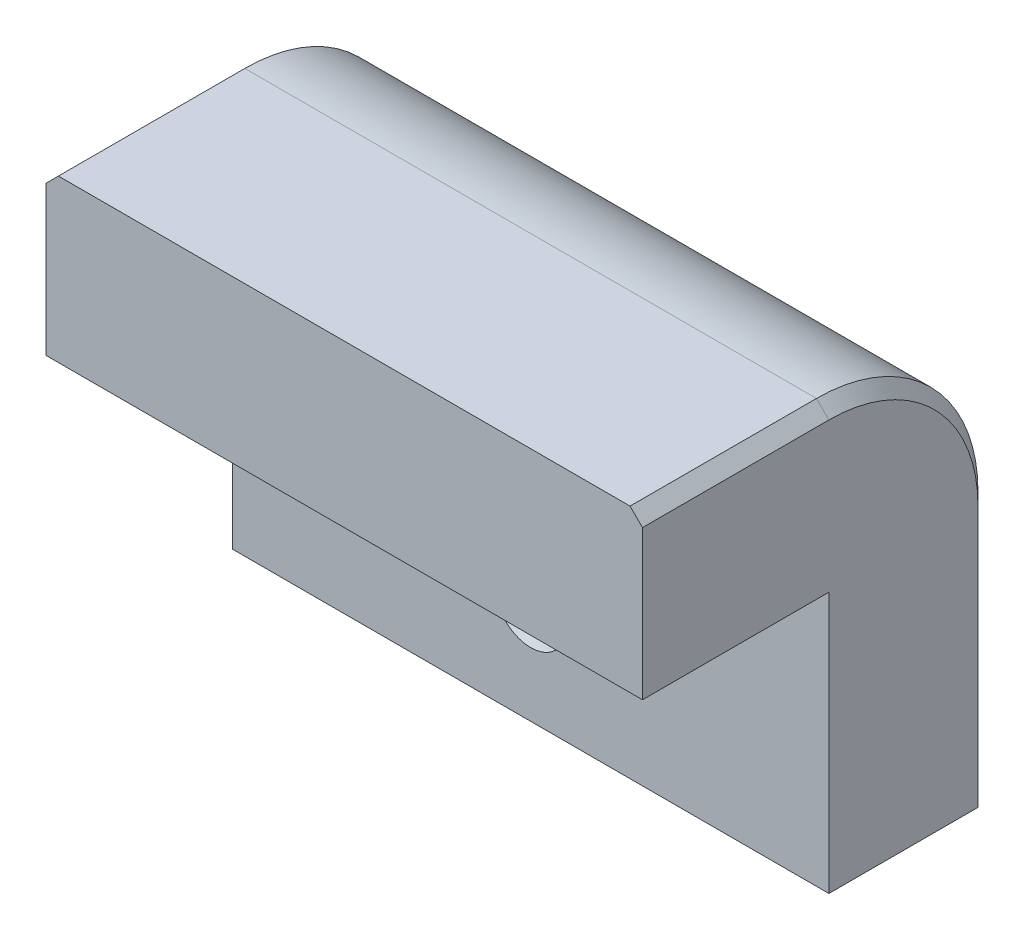
ISO-10303-21;
HEADER;
FILE_DESCRIPTION(('STEP AP214'),'2;1');
FILE_NAME('part.step','',(''),(''),'','','');
FILE_SCHEMA(('AUTOMOTIVE_DESIGN { 1 0 10303 214 1 1 1 1 }'));
ENDSEC;
DATA;
#1=APPLICATION_CONTEXT('core data for automotive mechanical design processes');
#2=APPLICATION_PROTOCOL_DEFINITION('international standard','automotive_design',2000,#1);
#3=PRODUCT_CONTEXT('',#1,'mechanical');
#4=PRODUCT('Part','Part','',(#3));
#5=PRODUCT_RELATED_PRODUCT_CATEGORY('part','',(#4));
#6=PRODUCT_DEFINITION_FORMATION('','',#4);
#7=PRODUCT_DEFINITION_CONTEXT('part definition',#1,'design');
#8=PRODUCT_DEFINITION('design','',#6,#7);
#9=PRODUCT_DEFINITION_SHAPE('','',#8);
#10=(LENGTH_UNIT() NAMED_UNIT(*) SI_UNIT(.MILLI.,.METRE.));
#11=(NAMED_UNIT(*) PLANE_ANGLE_UNIT() SI_UNIT($,.RADIAN.));
#12=(NAMED_UNIT(*) SI_UNIT($,.STERADIAN.) SOLID_ANGLE_UNIT());
#13=UNCERTAINTY_MEASURE_WITH_UNIT(LENGTH_MEASURE(1.E-05),#10,'distance_accuracy_value','');
#14=(GEOMETRIC_REPRESENTATION_CONTEXT(3) GLOBAL_UNCERTAINTY_ASSIGNED_CONTEXT((#13)) GLOBAL_UNIT_ASSIGNED_CONTEXT((#10,
#11,#12)) REPRESENTATION_CONTEXT('',''));
#15=CARTESIAN_POINT('',(0.,0.,0.));
#16=DIRECTION('',(0.,0.,1.));
#17=DIRECTION('',(1.,0.,0.));
#18=AXIS2_PLACEMENT_3D('',#15,#16,#17);
#19=CARTESIAN_POINT('',(-30.48,19.05,-8.255));
#20=DIRECTION('',(1.,0.,0.));
#21=DIRECTION('',(0.,0.,-1.));
#22=AXIS2_PLACEMENT_3D('',#19,#20,#21);
#23=PLANE('',#22);
#24=CARTESIAN_POINT('',(-30.48,19.05,8.255));
#25=DIRECTION('',(1.,0.,0.));
#26=DIRECTION('',(0.,0.,-1.));
#27=AXIS2_PLACEMENT_3D('',#24,#25,#26);
#28=CIRCLE('',#27,15.24);
#29=CARTESIAN_POINT('',(-30.48,34.29,8.25499999999995));
#30=VERTEX_POINT('',#29);
#31=CARTESIAN_POINT('',(-30.48,19.05,-6.985));
#32=VERTEX_POINT('',#31);
#33=EDGE_CURVE('E42',#30,#32,#28,.F.);
#34=ORIENTED_EDGE('',*,*,#33,.T.);
#35=DIRECTION('',(0.,-1.,0.));
#36=VECTOR('',#35,1.);
#37=CARTESIAN_POINT('',(-30.48,19.05,-6.985));
#38=LINE('',#37,#36);
#39=CARTESIAN_POINT('',(-30.48,-7.62,-6.98499999999999));
#40=VERTEX_POINT('',#39);
#41=EDGE_CURVE('E11',#32,#40,#38,.T.);
#42=ORIENTED_EDGE('',*,*,#41,.T.);
#43=DIRECTION('',(0.,0.,-1.));
#44=VECTOR('',#43,1.);
#45=CARTESIAN_POINT('',(-30.48,-7.62,8.255));
#46=LINE('',#45,#44);
#47=CARTESIAN_POINT('',(-30.48,-7.62,8.255));
#48=VERTEX_POINT('',#47);
#49=EDGE_CURVE('E189',#48,#40,#46,.T.);
#50=ORIENTED_EDGE('',*,*,#49,.F.);
#51=DIRECTION('',(0.,-1.,0.));
#52=VECTOR('',#51,1.);
#53=CARTESIAN_POINT('',(-30.48,19.05,8.255));
#54=LINE('',#53,#52);
#55=CARTESIAN_POINT('',(-30.48,19.05,8.255));
#56=VERTEX_POINT('',#55);
#57=EDGE_CURVE('E302',#56,#48,#54,.T.);
#58=ORIENTED_EDGE('',*,*,#57,.F.);
#59=DIRECTION('',(0.,0.,1.));
#60=VECTOR('',#59,1.);
#61=CARTESIAN_POINT('',(-30.48,19.05,-8.25500000000001));
#62=LINE('',#61,#60);
#63=CARTESIAN_POINT('',(-30.48,19.0500000000001,27.305));
#64=VERTEX_POINT('',#63);
#65=EDGE_CURVE('E204',#56,#64,#62,.T.);
#66=ORIENTED_EDGE('',*,*,#65,.T.);
#67=DIRECTION('',(0.,1.,0.));
#68=VECTOR('',#67,1.);
#69=CARTESIAN_POINT('',(-30.48,35.5600000000001,27.3049999999999));
#70=LINE('',#69,#68);
#71=CARTESIAN_POINT('',(-30.48,34.2900000000001,27.305));
#72=VERTEX_POINT('',#71);
#73=EDGE_CURVE('E202',#64,#72,#70,.T.);
#74=ORIENTED_EDGE('',*,*,#73,.T.);
#75=DIRECTION('',(0.,0.,-1.));
#76=VECTOR('',#75,1.);
#77=CARTESIAN_POINT('',(-30.48,34.29,8.25499999999995));
#78=LINE('',#77,#76);
#79=EDGE_CURVE('E53',#72,#30,#78,.T.);
#80=ORIENTED_EDGE('',*,*,#79,.T.);
#81=EDGE_LOOP('',(#34,#42,#50,#58,#66,#74,#80));
#82=FACE_BOUND('',#81,.T.);
#83=ADVANCED_FACE('F33',(#82),#23,.F.);
#84=CARTESIAN_POINT('',(-30.48,19.05,8.255));
#85=DIRECTION('',(0.,0.,-1.));
#86=DIRECTION('',(-1.,0.,0.));
#87=AXIS2_PLACEMENT_3D('',#84,#85,#86);
#88=PLANE('',#87);
#89=CARTESIAN_POINT('',(0.,2.5399999999999,8.255));
#90=DIRECTION('',(0.,0.,-1.));
#91=DIRECTION('',(-1.,0.,0.));
#92=AXIS2_PLACEMENT_3D('',#89,#90,#91);
#93=CIRCLE('',#92,3.63220000000002);
#94=CARTESIAN_POINT('',(-3.63220000000004,2.5399999999999,8.255));
#95=VERTEX_POINT('',#94);
#96=EDGE_CURVE('E292',#95,#95,#93,.T.);
#97=ORIENTED_EDGE('',*,*,#96,.T.);
#98=EDGE_LOOP('',(#97));
#99=FACE_BOUND('',#98,.T.);
#100=ORIENTED_EDGE('',*,*,#57,.T.);
#101=DIRECTION('',(-1.,0.,0.));
#102=VECTOR('',#101,1.);
#103=CARTESIAN_POINT('',(-30.48,-7.62,8.255));
#104=LINE('',#103,#102);
#105=CARTESIAN_POINT('',(30.48,-7.62,8.255));
#106=VERTEX_POINT('',#105);
#107=EDGE_CURVE('E198',#106,#48,#104,.T.);
#108=ORIENTED_EDGE('',*,*,#107,.F.);
#109=DIRECTION('',(0.,-1.,0.));
#110=VECTOR('',#109,1.);
#111=CARTESIAN_POINT('',(30.48,19.05,8.255));
#112=LINE('',#111,#110);
#113=CARTESIAN_POINT('',(30.48,19.05,8.255));
#114=VERTEX_POINT('',#113);
#115=EDGE_CURVE('E306',#114,#106,#112,.T.);
#116=ORIENTED_EDGE('',*,*,#115,.F.);
#117=DIRECTION('',(1.,0.,0.));
#118=VECTOR('',#117,1.);
#119=CARTESIAN_POINT('',(-30.48,19.05,8.255));
#120=LINE('',#119,#118);
#121=EDGE_CURVE('E212',#56,#114,#120,.T.);
#122=ORIENTED_EDGE('',*,*,#121,.F.);
#123=EDGE_LOOP('',(#100,#108,#116,#122));
#124=FACE_BOUND('',#123,.T.);
#125=ADVANCED_FACE('F324',(#99,#124),#88,.F.);
#126=CARTESIAN_POINT('',(30.48,19.05,-8.255));
#127=DIRECTION('',(-1.,0.,0.));
#128=DIRECTION('',(0.,0.,1.));
#129=AXIS2_PLACEMENT_3D('',#126,#127,#128);
#130=PLANE('',#129);
#131=DIRECTION('',(0.,0.,1.));
#132=VECTOR('',#131,1.);
#133=CARTESIAN_POINT('',(30.48,-7.62,8.255));
#134=LINE('',#133,#132);
#135=CARTESIAN_POINT('',(30.48,-7.62,-6.98499999999999));
#136=VERTEX_POINT('',#135);
#137=EDGE_CURVE('E196',#136,#106,#134,.T.);
#138=ORIENTED_EDGE('',*,*,#137,.F.);
#139=DIRECTION('',(0.,1.,0.));
#140=VECTOR('',#139,1.);
#141=CARTESIAN_POINT('',(30.48,19.05,-6.98499999999999));
#142=LINE('',#141,#140);
#143=CARTESIAN_POINT('',(30.48,19.05,-6.98500000000001));
#144=VERTEX_POINT('',#143);
#145=EDGE_CURVE('E278',#136,#144,#142,.T.);
#146=ORIENTED_EDGE('',*,*,#145,.T.);
#147=CARTESIAN_POINT('',(30.48,19.05,8.255));
#148=DIRECTION('',(-1.,0.,0.));
#149=DIRECTION('',(0.,0.,1.));
#150=AXIS2_PLACEMENT_3D('',#147,#148,#149);
#151=CIRCLE('',#150,15.24);
#152=CARTESIAN_POINT('',(30.48,34.29,8.25499999999995));
#153=VERTEX_POINT('',#152);
#154=EDGE_CURVE('E281',#144,#153,#151,.F.);
#155=ORIENTED_EDGE('',*,*,#154,.T.);
#156=DIRECTION('',(0.,0.,1.));
#157=VECTOR('',#156,1.);
#158=CARTESIAN_POINT('',(30.48,34.2900000000001,27.305));
#159=LINE('',#158,#157);
#160=CARTESIAN_POINT('',(30.48,34.2900000000001,27.305));
#161=VERTEX_POINT('',#160);
#162=EDGE_CURVE('E246',#153,#161,#159,.T.);
#163=ORIENTED_EDGE('',*,*,#162,.T.);
#164=DIRECTION('',(0.,-1.,0.));
#165=VECTOR('',#164,1.);
#166=CARTESIAN_POINT('',(30.48,35.5600000000001,27.3049999999999));
#167=LINE('',#166,#165);
#168=CARTESIAN_POINT('',(30.48,19.0500000000001,27.305));
#169=VERTEX_POINT('',#168);
#170=EDGE_CURVE('E201',#161,#169,#167,.T.);
#171=ORIENTED_EDGE('',*,*,#170,.T.);
#172=DIRECTION('',(0.,0.,-1.));
#173=VECTOR('',#172,1.);
#174=CARTESIAN_POINT('',(30.48,19.05,-8.25500000000001));
#175=LINE('',#174,#173);
#176=EDGE_CURVE('E215',#169,#114,#175,.T.);
#177=ORIENTED_EDGE('',*,*,#176,.T.);
#178=ORIENTED_EDGE('',*,*,#115,.T.);
#179=EDGE_LOOP('',(#138,#146,#155,#163,#171,#177,#178));
#180=FACE_BOUND('',#179,.T.);
#181=ADVANCED_FACE('F335',(#180),#130,.F.);
#182=CARTESIAN_POINT('',(-30.48,19.05,-8.255));
#183=DIRECTION('',(0.,0.,1.));
#184=DIRECTION('',(1.,0.,0.));
#185=AXIS2_PLACEMENT_3D('',#182,#183,#184);
#186=PLANE('',#185);
#187=CARTESIAN_POINT('',(0.,2.5399999999999,-8.25500000000001));
#188=DIRECTION('',(0.,0.,1.));
#189=DIRECTION('',(1.,0.,0.));
#190=AXIS2_PLACEMENT_3D('',#187,#188,#189);
#191=CIRCLE('',#190,1.524);
#192=CARTESIAN_POINT('',(1.52399999999998,2.5399999999999,-8.25500000000001));
#193=VERTEX_POINT('',#192);
#194=EDGE_CURVE('E186',#193,#193,#191,.T.);
#195=ORIENTED_EDGE('',*,*,#194,.T.);
#196=EDGE_LOOP('',(#195));
#197=FACE_BOUND('',#196,.T.);
#198=DIRECTION('',(-1.,0.,0.));
#199=VECTOR('',#198,1.);
#200=CARTESIAN_POINT('',(-30.48,19.05,-8.255));
#201=LINE('',#200,#199);
#202=CARTESIAN_POINT('',(29.21,19.05,-8.255));
#203=VERTEX_POINT('',#202);
#204=CARTESIAN_POINT('',(-29.21,19.05,-8.255));
#205=VERTEX_POINT('',#204);
#206=EDGE_CURVE('E309',#203,#205,#201,.T.);
#207=ORIENTED_EDGE('',*,*,#206,.F.);
#208=DIRECTION('',(0.,-1.,0.));
#209=VECTOR('',#208,1.);
#210=CARTESIAN_POINT('',(29.21,19.05,-8.255));
#211=LINE('',#210,#209);
#212=CARTESIAN_POINT('',(29.21,-7.62,-8.25500000000001));
#213=VERTEX_POINT('',#212);
#214=EDGE_CURVE('E287',#203,#213,#211,.T.);
#215=ORIENTED_EDGE('',*,*,#214,.T.);
#216=DIRECTION('',(1.,0.,0.));
#217=VECTOR('',#216,1.);
#218=CARTESIAN_POINT('',(-30.48,-7.62,-8.255));
#219=LINE('',#218,#217);
#220=CARTESIAN_POINT('',(-29.21,-7.62,-8.255));
#221=VERTEX_POINT('',#220);
#222=EDGE_CURVE('E193',#221,#213,#219,.T.);
#223=ORIENTED_EDGE('',*,*,#222,.F.);
#224=DIRECTION('',(0.,1.,0.));
#225=VECTOR('',#224,1.);
#226=CARTESIAN_POINT('',(-29.21,19.05,-8.255));
#227=LINE('',#226,#225);
#228=EDGE_CURVE('E290',#221,#205,#227,.T.);
#229=ORIENTED_EDGE('',*,*,#228,.T.);
#230=EDGE_LOOP('',(#207,#215,#223,#229));
#231=FACE_BOUND('',#230,.T.);
#232=ADVANCED_FACE('F314',(#197,#231),#186,.F.);
#233=CARTESIAN_POINT('',(-69.6857865627002,19.05,8.255));
#234=DIRECTION('',(1.,0.,0.));
#235=DIRECTION('',(0.,0.,-1.));
#236=AXIS2_PLACEMENT_3D('',#233,#234,#235);
#237=CYLINDRICAL_SURFACE('',#236,16.51);
#238=DIRECTION('',(1.,0.,0.));
#239=VECTOR('',#238,1.);
#240=CARTESIAN_POINT('',(-69.6857865627002,35.56,8.25499999999994));
#241=LINE('',#240,#239);
#242=CARTESIAN_POINT('',(-29.21,35.56,8.25499999999994));
#243=VERTEX_POINT('',#242);
#244=CARTESIAN_POINT('',(29.21,35.56,8.25499999999994));
#245=VERTEX_POINT('',#244);
#246=EDGE_CURVE('E213',#243,#245,#241,.T.);
#247=ORIENTED_EDGE('',*,*,#246,.T.);
#248=CARTESIAN_POINT('',(29.21,19.05,8.255));
#249=DIRECTION('',(-1.,0.,0.));
#250=DIRECTION('',(0.,0.,1.));
#251=AXIS2_PLACEMENT_3D('',#248,#249,#250);
#252=CIRCLE('',#251,16.51);
#253=EDGE_CURVE('E235',#245,#203,#252,.T.);
#254=ORIENTED_EDGE('',*,*,#253,.T.);
#255=ORIENTED_EDGE('',*,*,#206,.T.);
#256=CARTESIAN_POINT('',(-29.21,19.05,8.255));
#257=DIRECTION('',(1.,0.,0.));
#258=DIRECTION('',(0.,0.,-1.));
#259=AXIS2_PLACEMENT_3D('',#256,#257,#258);
#260=CIRCLE('',#259,16.51);
#261=EDGE_CURVE('E238',#205,#243,#260,.T.);
#262=ORIENTED_EDGE('',*,*,#261,.T.);
#263=EDGE_LOOP('',(#247,#254,#255,#262));
#264=FACE_BOUND('',#263,.T.);
#265=ADVANCED_FACE('F232',(#264),#237,.T.);
#266=CARTESIAN_POINT('',(-69.6857865627002,19.05,-8.25500000000001));
#267=DIRECTION('',(0.,-1.,0.));
#268=DIRECTION('',(0.,0.,-1.));
#269=AXIS2_PLACEMENT_3D('',#266,#267,#268);
#270=PLANE('',#269);
#271=ORIENTED_EDGE('',*,*,#65,.F.);
#272=ORIENTED_EDGE('',*,*,#121,.T.);
#273=ORIENTED_EDGE('',*,*,#176,.F.);
#274=DIRECTION('',(1.,0.,0.));
#275=VECTOR('',#274,1.);
#276=CARTESIAN_POINT('',(-69.6857865627002,19.0500000000001,27.305));
#277=LINE('',#276,#275);
#278=EDGE_CURVE('E205',#64,#169,#277,.T.);
#279=ORIENTED_EDGE('',*,*,#278,.F.);
#280=EDGE_LOOP('',(#271,#272,#273,#279));
#281=FACE_BOUND('',#280,.T.);
#282=ADVANCED_FACE('F329',(#281),#270,.T.);
#283=CARTESIAN_POINT('',(-69.6857865627002,35.5600000000001,27.3049999999999));
#284=DIRECTION('',(0.,0.,1.));
#285=DIRECTION('',(0.,-1.,0.));
#286=AXIS2_PLACEMENT_3D('',#283,#284,#285);
#287=PLANE('',#286);
#288=ORIENTED_EDGE('',*,*,#170,.F.);
#289=DIRECTION('',(-0.707106781186546,0.707106781186549,0.));
#290=VECTOR('',#289,1.);
#291=CARTESIAN_POINT('',(-20.2378932813499,85.0078932813501,27.3049999999998));
#292=LINE('',#291,#290);
#293=CARTESIAN_POINT('',(29.21,35.5600000000001,27.3049999999999));
#294=VERTEX_POINT('',#293);
#295=EDGE_CURVE('E273',#161,#294,#292,.T.);
#296=ORIENTED_EDGE('',*,*,#295,.T.);
#297=DIRECTION('',(1.,0.,0.));
#298=VECTOR('',#297,1.);
#299=CARTESIAN_POINT('',(-69.6857865627002,35.5600000000001,27.3049999999999));
#300=LINE('',#299,#298);
#301=CARTESIAN_POINT('',(-29.21,35.5600000000001,27.3049999999999));
#302=VERTEX_POINT('',#301);
#303=EDGE_CURVE('E223',#302,#294,#300,.T.);
#304=ORIENTED_EDGE('',*,*,#303,.F.);
#305=DIRECTION('',(-0.70710678118655,-0.707106781186545,0.));
#306=VECTOR('',#305,1.);
#307=CARTESIAN_POINT('',(-49.4478932813502,15.32210671865,27.305));
#308=LINE('',#307,#306);
#309=EDGE_CURVE('E272',#302,#72,#308,.T.);
#310=ORIENTED_EDGE('',*,*,#309,.T.);
#311=ORIENTED_EDGE('',*,*,#73,.F.);
#312=ORIENTED_EDGE('',*,*,#278,.T.);
#313=EDGE_LOOP('',(#288,#296,#304,#310,#311,#312));
#314=FACE_BOUND('',#313,.T.);
#315=ADVANCED_FACE('F333',(#314),#287,.T.);
#316=CARTESIAN_POINT('',(-69.6857865627002,35.56,8.25499999999994));
#317=DIRECTION('',(0.,1.,0.));
#318=DIRECTION('',(0.,0.,1.));
#319=AXIS2_PLACEMENT_3D('',#316,#317,#318);
#320=PLANE('',#319);
#321=ORIENTED_EDGE('',*,*,#303,.T.);
#322=DIRECTION('',(0.,0.,-1.));
#323=VECTOR('',#322,1.);
#324=CARTESIAN_POINT('',(29.21,35.56,8.25499999999994));
#325=LINE('',#324,#323);
#326=EDGE_CURVE('E245',#294,#245,#325,.T.);
#327=ORIENTED_EDGE('',*,*,#326,.T.);
#328=ORIENTED_EDGE('',*,*,#246,.F.);
#329=DIRECTION('',(0.,0.,1.));
#330=VECTOR('',#329,1.);
#331=CARTESIAN_POINT('',(-29.21,35.5600000000001,27.3049999999999));
#332=LINE('',#331,#330);
#333=EDGE_CURVE('E271',#243,#302,#332,.T.);
#334=ORIENTED_EDGE('',*,*,#333,.T.);
#335=EDGE_LOOP('',(#321,#327,#328,#334));
#336=FACE_BOUND('',#335,.T.);
#337=ADVANCED_FACE('F382',(#336),#320,.T.);
#338=CARTESIAN_POINT('',(0.,-7.62,0.));
#339=DIRECTION('',(0.,-1.,0.));
#340=DIRECTION('',(0.,0.,-1.));
#341=AXIS2_PLACEMENT_3D('',#338,#339,#340);
#342=PLANE('',#341);
#343=DIRECTION('',(1.,0.,0.));
#344=VECTOR('',#343,1.);
#345=CARTESIAN_POINT('',(-26.035,-7.62,-3.81));
#346=LINE('',#345,#344);
#347=CARTESIAN_POINT('',(-26.035,-7.62,-3.81));
#348=VERTEX_POINT('',#347);
#349=CARTESIAN_POINT('',(26.035,-7.62,-3.81));
#350=VERTEX_POINT('',#349);
#351=EDGE_CURVE('E149',#348,#350,#346,.T.);
#352=ORIENTED_EDGE('',*,*,#351,.F.);
#353=DIRECTION('',(0.,0.,-1.));
#354=VECTOR('',#353,1.);
#355=CARTESIAN_POINT('',(-26.035,-7.62,3.81));
#356=LINE('',#355,#354);
#357=CARTESIAN_POINT('',(-26.035,-7.62,3.81));
#358=VERTEX_POINT('',#357);
#359=EDGE_CURVE('E166',#358,#348,#356,.T.);
#360=ORIENTED_EDGE('',*,*,#359,.F.);
#361=DIRECTION('',(-1.,0.,0.));
#362=VECTOR('',#361,1.);
#363=CARTESIAN_POINT('',(26.035,-7.62,3.81));
#364=LINE('',#363,#362);
#365=CARTESIAN_POINT('',(26.035,-7.62,3.81));
#366=VERTEX_POINT('',#365);
#367=EDGE_CURVE('E169',#366,#358,#364,.T.);
#368=ORIENTED_EDGE('',*,*,#367,.F.);
#369=DIRECTION('',(0.,0.,1.));
#370=VECTOR('',#369,1.);
#371=CARTESIAN_POINT('',(26.035,-7.62,-3.81));
#372=LINE('',#371,#370);
#373=EDGE_CURVE('E175',#350,#366,#372,.T.);
#374=ORIENTED_EDGE('',*,*,#373,.F.);
#375=EDGE_LOOP('',(#352,#360,#368,#374));
#376=FACE_BOUND('',#375,.T.);
#377=ORIENTED_EDGE('',*,*,#222,.T.);
#378=DIRECTION('',(-0.707106781186547,0.,-0.707106781186548));
#379=VECTOR('',#378,1.);
#380=CARTESIAN_POINT('',(18.7325,-7.62,-18.7325));
#381=LINE('',#380,#379);
#382=EDGE_CURVE('E283',#213,#136,#381,.F.);
#383=ORIENTED_EDGE('',*,*,#382,.T.);
#384=ORIENTED_EDGE('',*,*,#137,.T.);
#385=ORIENTED_EDGE('',*,*,#107,.T.);
#386=ORIENTED_EDGE('',*,*,#49,.T.);
#387=DIRECTION('',(-0.70710678118655,0.,0.707106781186546));
#388=VECTOR('',#387,1.);
#389=CARTESIAN_POINT('',(-18.7324999999999,-7.62,-18.7325));
#390=LINE('',#389,#388);
#391=EDGE_CURVE('E285',#40,#221,#390,.F.);
#392=ORIENTED_EDGE('',*,*,#391,.T.);
#393=EDGE_LOOP('',(#377,#383,#384,#385,#386,#392));
#394=FACE_BOUND('',#393,.T.);
#395=ADVANCED_FACE('F320',(#376,#394),#342,.T.);
#396=CARTESIAN_POINT('',(0.,2.5399999999999,-8.25500000000001));
#397=DIRECTION('',(0.,0.,1.));
#398=DIRECTION('',(1.,0.,0.));
#399=AXIS2_PLACEMENT_3D('',#396,#397,#398);
#400=CYLINDRICAL_SURFACE('',#399,1.524);
#401=CARTESIAN_POINT('',(0.,2.5399999999999,-3.81));
#402=DIRECTION('',(0.,0.,-1.));
#403=DIRECTION('',(-1.,0.,0.));
#404=AXIS2_PLACEMENT_3D('',#401,#402,#403);
#405=CIRCLE('',#404,1.524);
#406=CARTESIAN_POINT('',(-1.52400000000002,2.5399999999999,-3.81));
#407=VERTEX_POINT('',#406);
#408=EDGE_CURVE('E190',#407,#407,#405,.F.);
#409=ORIENTED_EDGE('',*,*,#408,.T.);
#410=EDGE_LOOP('',(#409));
#411=FACE_BOUND('',#410,.T.);
#412=ORIENTED_EDGE('',*,*,#194,.F.);
#413=EDGE_LOOP('',(#412));
#414=FACE_BOUND('',#413,.T.);
#415=ADVANCED_FACE('F365',(#411,#414),#400,.F.);
#416=CARTESIAN_POINT('',(0.,2.5399999999999,3.81));
#417=DIRECTION('',(0.,0.,1.));
#418=DIRECTION('',(1.,0.,0.));
#419=AXIS2_PLACEMENT_3D('',#416,#417,#418);
#420=CIRCLE('',#419,1.524);
#421=CARTESIAN_POINT('',(1.52399999999998,2.5399999999999,3.81));
#422=VERTEX_POINT('',#421);
#423=EDGE_CURVE('E182',#422,#422,#420,.F.);
#424=ORIENTED_EDGE('',*,*,#423,.T.);
#425=EDGE_LOOP('',(#424));
#426=FACE_BOUND('',#425,.T.);
#427=CARTESIAN_POINT('',(0.,2.5399999999999,6.42236969933582));
#428=DIRECTION('',(0.,0.,-1.));
#429=DIRECTION('',(-1.,0.,0.));
#430=AXIS2_PLACEMENT_3D('',#427,#428,#429);
#431=CIRCLE('',#430,1.524);
#432=CARTESIAN_POINT('',(-1.52400000000002,2.5399999999999,6.42236969933582));
#433=VERTEX_POINT('',#432);
#434=EDGE_CURVE('E299',#433,#433,#431,.F.);
#435=ORIENTED_EDGE('',*,*,#434,.T.);
#436=EDGE_LOOP('',(#435));
#437=FACE_BOUND('',#436,.T.);
#438=ADVANCED_FACE('F357',(#426,#437),#400,.F.);
#439=CARTESIAN_POINT('',(0.,2.5399999999999,6.42236969933582));
#440=DIRECTION('',(0.,0.,1.));
#441=DIRECTION('',(1.,0.,0.));
#442=AXIS2_PLACEMENT_3D('',#439,#440,#441);
#443=CONICAL_SURFACE('',#442,1.524,0.855211333477223);
#444=ORIENTED_EDGE('',*,*,#96,.F.);
#445=EDGE_LOOP('',(#444));
#446=FACE_BOUND('',#445,.T.);
#447=ORIENTED_EDGE('',*,*,#434,.F.);
#448=EDGE_LOOP('',(#447));
#449=FACE_BOUND('',#448,.T.);
#450=ADVANCED_FACE('F355',(#446,#449),#443,.F.);
#451=CARTESIAN_POINT('',(-26.035,11.43,-3.81));
#452=DIRECTION('',(0.,0.,-1.));
#453=DIRECTION('',(-1.,0.,0.));
#454=AXIS2_PLACEMENT_3D('',#451,#452,#453);
#455=PLANE('',#454);
#456=ORIENTED_EDGE('',*,*,#351,.T.);
#457=DIRECTION('',(0.,-1.,0.));
#458=VECTOR('',#457,1.);
#459=CARTESIAN_POINT('',(26.035,11.43,-3.81));
#460=LINE('',#459,#458);
#461=CARTESIAN_POINT('',(26.035,11.43,-3.81));
#462=VERTEX_POINT('',#461);
#463=EDGE_CURVE('E141',#462,#350,#460,.T.);
#464=ORIENTED_EDGE('',*,*,#463,.F.);
#465=DIRECTION('',(1.,0.,0.));
#466=VECTOR('',#465,1.);
#467=CARTESIAN_POINT('',(-26.035,11.43,-3.81));
#468=LINE('',#467,#466);
#469=CARTESIAN_POINT('',(-26.035,11.43,-3.81));
#470=VERTEX_POINT('',#469);
#471=EDGE_CURVE('E146',#470,#462,#468,.T.);
#472=ORIENTED_EDGE('',*,*,#471,.F.);
#473=DIRECTION('',(0.,-1.,0.));
#474=VECTOR('',#473,1.);
#475=CARTESIAN_POINT('',(-26.035,11.43,-3.81));
#476=LINE('',#475,#474);
#477=EDGE_CURVE('E180',#470,#348,#476,.T.);
#478=ORIENTED_EDGE('',*,*,#477,.T.);
#479=EDGE_LOOP('',(#456,#464,#472,#478));
#480=FACE_BOUND('',#479,.T.);
#481=ORIENTED_EDGE('',*,*,#408,.F.);
#482=EDGE_LOOP('',(#481));
#483=FACE_BOUND('',#482,.T.);
#484=ADVANCED_FACE('F143',(#480,#483),#455,.F.);
#485=CARTESIAN_POINT('',(26.035,11.43,3.81));
#486=DIRECTION('',(0.,0.,1.));
#487=DIRECTION('',(1.,0.,0.));
#488=AXIS2_PLACEMENT_3D('',#485,#486,#487);
#489=PLANE('',#488);
#490=ORIENTED_EDGE('',*,*,#367,.T.);
#491=DIRECTION('',(0.,-1.,0.));
#492=VECTOR('',#491,1.);
#493=CARTESIAN_POINT('',(-26.035,11.43,3.81));
#494=LINE('',#493,#492);
#495=CARTESIAN_POINT('',(-26.035,11.43,3.81));
#496=VERTEX_POINT('',#495);
#497=EDGE_CURVE('E183',#496,#358,#494,.T.);
#498=ORIENTED_EDGE('',*,*,#497,.F.);
#499=DIRECTION('',(-1.,0.,0.));
#500=VECTOR('',#499,1.);
#501=CARTESIAN_POINT('',(26.035,11.43,3.81));
#502=LINE('',#501,#500);
#503=CARTESIAN_POINT('',(26.035,11.43,3.81));
#504=VERTEX_POINT('',#503);
#505=EDGE_CURVE('E162',#504,#496,#502,.T.);
#506=ORIENTED_EDGE('',*,*,#505,.F.);
#507=DIRECTION('',(0.,-1.,0.));
#508=VECTOR('',#507,1.);
#509=CARTESIAN_POINT('',(26.035,11.43,3.81));
#510=LINE('',#509,#508);
#511=EDGE_CURVE('E153',#504,#366,#510,.T.);
#512=ORIENTED_EDGE('',*,*,#511,.T.);
#513=EDGE_LOOP('',(#490,#498,#506,#512));
#514=FACE_BOUND('',#513,.T.);
#515=ORIENTED_EDGE('',*,*,#423,.F.);
#516=EDGE_LOOP('',(#515));
#517=FACE_BOUND('',#516,.T.);
#518=ADVANCED_FACE('F363',(#514,#517),#489,.F.);
#519=CARTESIAN_POINT('',(-26.035,11.43,3.81));
#520=DIRECTION('',(-1.,0.,0.));
#521=DIRECTION('',(0.,0.,1.));
#522=AXIS2_PLACEMENT_3D('',#519,#520,#521);
#523=PLANE('',#522);
#524=ORIENTED_EDGE('',*,*,#359,.T.);
#525=ORIENTED_EDGE('',*,*,#477,.F.);
#526=DIRECTION('',(0.,0.,-1.));
#527=VECTOR('',#526,1.);
#528=CARTESIAN_POINT('',(-26.035,11.43,3.81));
#529=LINE('',#528,#527);
#530=EDGE_CURVE('E154',#496,#470,#529,.T.);
#531=ORIENTED_EDGE('',*,*,#530,.F.);
#532=ORIENTED_EDGE('',*,*,#497,.T.);
#533=EDGE_LOOP('',(#524,#525,#531,#532));
#534=FACE_BOUND('',#533,.T.);
#535=ADVANCED_FACE('F450',(#534),#523,.F.);
#536=CARTESIAN_POINT('',(26.035,11.43,-3.81));
#537=DIRECTION('',(1.,0.,0.));
#538=DIRECTION('',(0.,0.,-1.));
#539=AXIS2_PLACEMENT_3D('',#536,#537,#538);
#540=PLANE('',#539);
#541=ORIENTED_EDGE('',*,*,#373,.T.);
#542=ORIENTED_EDGE('',*,*,#511,.F.);
#543=DIRECTION('',(0.,0.,1.));
#544=VECTOR('',#543,1.);
#545=CARTESIAN_POINT('',(26.035,11.43,-3.81));
#546=LINE('',#545,#544);
#547=EDGE_CURVE('E157',#462,#504,#546,.T.);
#548=ORIENTED_EDGE('',*,*,#547,.F.);
#549=ORIENTED_EDGE('',*,*,#463,.T.);
#550=EDGE_LOOP('',(#541,#542,#548,#549));
#551=FACE_BOUND('',#550,.T.);
#552=ADVANCED_FACE('F158',(#551),#540,.F.);
#553=CARTESIAN_POINT('',(0.,11.43,0.));
#554=DIRECTION('',(0.,-1.,0.));
#555=DIRECTION('',(0.,0.,-1.));
#556=AXIS2_PLACEMENT_3D('',#553,#554,#555);
#557=PLANE('',#556);
#558=ORIENTED_EDGE('',*,*,#471,.T.);
#559=ORIENTED_EDGE('',*,*,#547,.T.);
#560=ORIENTED_EDGE('',*,*,#505,.T.);
#561=ORIENTED_EDGE('',*,*,#530,.T.);
#562=EDGE_LOOP('',(#558,#559,#560,#561));
#563=FACE_BOUND('',#562,.T.);
#564=ADVANCED_FACE('F164',(#563),#557,.T.);
#565=CARTESIAN_POINT('',(30.48,34.2899999999999,-8.25500000000005));
#566=DIRECTION('',(0.707106781186549,0.707106781186546,0.));
#567=DIRECTION('',(0.,0.,-1.));
#568=AXIS2_PLACEMENT_3D('',#565,#566,#567);
#569=PLANE('',#568);
#570=ORIENTED_EDGE('',*,*,#295,.F.);
#571=ORIENTED_EDGE('',*,*,#162,.F.);
#572=DIRECTION('',(0.707106781186547,-0.707106781186549,0.));
#573=VECTOR('',#572,1.);
#574=CARTESIAN_POINT('',(29.21,35.56,8.25499999999994));
#575=LINE('',#574,#573);
#576=EDGE_CURVE('E176',#245,#153,#575,.T.);
#577=ORIENTED_EDGE('',*,*,#576,.F.);
#578=ORIENTED_EDGE('',*,*,#326,.F.);
#579=EDGE_LOOP('',(#570,#571,#577,#578));
#580=FACE_BOUND('',#579,.T.);
#581=ADVANCED_FACE('F244',(#580),#569,.T.);
#582=CARTESIAN_POINT('',(30.48,19.05,8.255));
#583=DIRECTION('',(-1.,0.,0.));
#584=DIRECTION('',(0.,0.,1.));
#585=AXIS2_PLACEMENT_3D('',#582,#583,#584);
#586=CONICAL_SURFACE('',#585,15.24,0.785398163397448);
#587=ORIENTED_EDGE('',*,*,#576,.T.);
#588=ORIENTED_EDGE('',*,*,#154,.F.);
#589=DIRECTION('',(0.707106781186548,0.,0.707106781186547));
#590=VECTOR('',#589,1.);
#591=CARTESIAN_POINT('',(29.21,19.05,-8.25500000000001));
#592=LINE('',#591,#590);
#593=EDGE_CURVE('E249',#203,#144,#592,.T.);
#594=ORIENTED_EDGE('',*,*,#593,.F.);
#595=ORIENTED_EDGE('',*,*,#253,.F.);
#596=EDGE_LOOP('',(#587,#588,#594,#595));
#597=FACE_BOUND('',#596,.T.);
#598=ADVANCED_FACE('F252',(#597),#586,.T.);
#599=CARTESIAN_POINT('',(29.21,19.05,-8.255));
#600=DIRECTION('',(-0.707106781186548,0.,0.707106781186547));
#601=DIRECTION('',(0.,-1.,0.));
#602=AXIS2_PLACEMENT_3D('',#599,#600,#601);
#603=PLANE('',#602);
#604=ORIENTED_EDGE('',*,*,#593,.T.);
#605=ORIENTED_EDGE('',*,*,#145,.F.);
#606=ORIENTED_EDGE('',*,*,#382,.F.);
#607=ORIENTED_EDGE('',*,*,#214,.F.);
#608=EDGE_LOOP('',(#604,#605,#606,#607));
#609=FACE_BOUND('',#608,.T.);
#610=ADVANCED_FACE('F338',(#609),#603,.F.);
#611=CARTESIAN_POINT('',(-30.48,34.29,-8.25500000000005));
#612=DIRECTION('',(-0.707106781186545,0.70710678118655,0.));
#613=DIRECTION('',(0.,0.,1.));
#614=AXIS2_PLACEMENT_3D('',#611,#612,#613);
#615=PLANE('',#614);
#616=ORIENTED_EDGE('',*,*,#309,.F.);
#617=ORIENTED_EDGE('',*,*,#333,.F.);
#618=DIRECTION('',(0.70710678118655,0.707106781186545,0.));
#619=VECTOR('',#618,1.);
#620=CARTESIAN_POINT('',(-30.48,34.29,8.25499999999995));
#621=LINE('',#620,#619);
#622=EDGE_CURVE('E37',#30,#243,#621,.T.);
#623=ORIENTED_EDGE('',*,*,#622,.F.);
#624=ORIENTED_EDGE('',*,*,#79,.F.);
#625=EDGE_LOOP('',(#616,#617,#623,#624));
#626=FACE_BOUND('',#625,.T.);
#627=ADVANCED_FACE('F35',(#626),#615,.T.);
#628=CARTESIAN_POINT('',(-30.48,19.05,8.255));
#629=DIRECTION('',(1.,0.,0.));
#630=DIRECTION('',(0.,0.,-1.));
#631=AXIS2_PLACEMENT_3D('',#628,#629,#630);
#632=CONICAL_SURFACE('',#631,15.24,0.785398163397446);
#633=ORIENTED_EDGE('',*,*,#622,.T.);
#634=ORIENTED_EDGE('',*,*,#261,.F.);
#635=DIRECTION('',(0.707106781186549,0.,-0.707106781186546));
#636=VECTOR('',#635,1.);
#637=CARTESIAN_POINT('',(-30.48,19.05,-6.985));
#638=LINE('',#637,#636);
#639=EDGE_CURVE('E261',#32,#205,#638,.T.);
#640=ORIENTED_EDGE('',*,*,#639,.F.);
#641=ORIENTED_EDGE('',*,*,#33,.F.);
#642=EDGE_LOOP('',(#633,#634,#640,#641));
#643=FACE_BOUND('',#642,.T.);
#644=ADVANCED_FACE('F268',(#643),#632,.T.);
#645=CARTESIAN_POINT('',(-30.48,19.05,-6.985));
#646=DIRECTION('',(0.707106781186546,0.,0.70710678118655));
#647=DIRECTION('',(0.,-1.,0.));
#648=AXIS2_PLACEMENT_3D('',#645,#646,#647);
#649=PLANE('',#648);
#650=ORIENTED_EDGE('',*,*,#639,.T.);
#651=ORIENTED_EDGE('',*,*,#228,.F.);
#652=ORIENTED_EDGE('',*,*,#391,.F.);
#653=ORIENTED_EDGE('',*,*,#41,.F.);
#654=EDGE_LOOP('',(#650,#651,#652,#653));
#655=FACE_BOUND('',#654,.T.);
#656=ADVANCED_FACE('F316',(#655),#649,.F.);
#657=CLOSED_SHELL('',(#83,#125,#181,#232,#265,#282,#315,#337,#395,#415,#438,#450,#484,#518,#535,
#552,#564,#581,#598,#610,#627,#644,#656));
#658=MANIFOLD_SOLID_BREP('B2',#657);
#659=ADVANCED_BREP_SHAPE_REPRESENTATION('',(#18,#658),#14);
#660=SHAPE_DEFINITION_REPRESENTATION(#9,#659);
ENDSEC;
END-ISO-10303-21;
